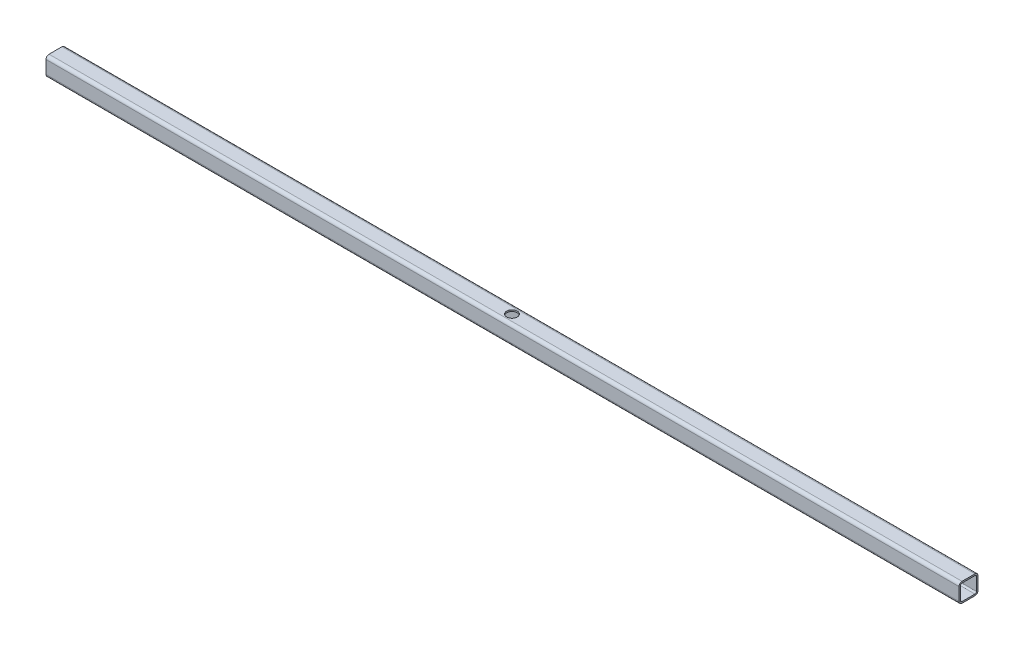
ISO-10303-21;
HEADER;
FILE_DESCRIPTION(('STEP AP214'),'2;1');
FILE_NAME('part.step','',(''),(''),'','','');
FILE_SCHEMA(('AUTOMOTIVE_DESIGN { 1 0 10303 214 1 1 1 1 }'));
ENDSEC;
DATA;
#1=APPLICATION_CONTEXT('core data for automotive mechanical design processes');
#2=APPLICATION_PROTOCOL_DEFINITION('international standard','automotive_design',2000,#1);
#3=PRODUCT_CONTEXT('',#1,'mechanical');
#4=PRODUCT('Part','Part','',(#3));
#5=PRODUCT_RELATED_PRODUCT_CATEGORY('part','',(#4));
#6=PRODUCT_DEFINITION_FORMATION('','',#4);
#7=PRODUCT_DEFINITION_CONTEXT('part definition',#1,'design');
#8=PRODUCT_DEFINITION('design','',#6,#7);
#9=PRODUCT_DEFINITION_SHAPE('','',#8);
#10=(LENGTH_UNIT() NAMED_UNIT(*) SI_UNIT(.MILLI.,.METRE.));
#11=(NAMED_UNIT(*) PLANE_ANGLE_UNIT() SI_UNIT($,.RADIAN.));
#12=(NAMED_UNIT(*) SI_UNIT($,.STERADIAN.) SOLID_ANGLE_UNIT());
#13=UNCERTAINTY_MEASURE_WITH_UNIT(LENGTH_MEASURE(1.E-05),#10,'distance_accuracy_value','');
#14=(GEOMETRIC_REPRESENTATION_CONTEXT(3) GLOBAL_UNCERTAINTY_ASSIGNED_CONTEXT((#13)) GLOBAL_UNIT_ASSIGNED_CONTEXT((#10,
#11,#12)) REPRESENTATION_CONTEXT('',''));
#15=CARTESIAN_POINT('',(0.,0.,0.));
#16=DIRECTION('',(0.,0.,1.));
#17=DIRECTION('',(1.,0.,0.));
#18=AXIS2_PLACEMENT_3D('',#15,#16,#17);
#19=CARTESIAN_POINT('',(1920.,13.6,-13.6));
#20=DIRECTION('',(-1.,0.,0.));
#21=DIRECTION('',(0.,0.,1.));
#22=AXIS2_PLACEMENT_3D('',#19,#20,#21);
#23=CYLINDRICAL_SURFACE('',#22,6.4);
#24=CARTESIAN_POINT('',(0.,13.6,-13.6));
#25=DIRECTION('',(1.,0.,0.));
#26=DIRECTION('',(0.,0.,-1.));
#27=AXIS2_PLACEMENT_3D('',#24,#25,#26);
#28=CIRCLE('',#27,6.4);
#29=CARTESIAN_POINT('',(0.,13.6,-20.));
#30=VERTEX_POINT('',#29);
#31=CARTESIAN_POINT('',(0.,20.,-13.6));
#32=VERTEX_POINT('',#31);
#33=EDGE_CURVE('E253',#30,#32,#28,.T.);
#34=ORIENTED_EDGE('',*,*,#33,.T.);
#35=DIRECTION('',(-1.,0.,0.));
#36=VECTOR('',#35,1.);
#37=CARTESIAN_POINT('',(1920.,20.,-13.6));
#38=LINE('',#37,#36);
#39=CARTESIAN_POINT('',(1920.,20.,-13.6));
#40=VERTEX_POINT('',#39);
#41=EDGE_CURVE('E12',#40,#32,#38,.T.);
#42=ORIENTED_EDGE('',*,*,#41,.F.);
#43=CARTESIAN_POINT('',(1920.,13.6,-13.6));
#44=DIRECTION('',(1.,0.,0.));
#45=DIRECTION('',(0.,0.,-1.));
#46=AXIS2_PLACEMENT_3D('',#43,#44,#45);
#47=CIRCLE('',#46,6.4);
#48=CARTESIAN_POINT('',(1920.,13.6,-20.));
#49=VERTEX_POINT('',#48);
#50=EDGE_CURVE('E362',#49,#40,#47,.T.);
#51=ORIENTED_EDGE('',*,*,#50,.F.);
#52=DIRECTION('',(-1.,0.,0.));
#53=VECTOR('',#52,1.);
#54=CARTESIAN_POINT('',(1920.,13.6,-20.));
#55=LINE('',#54,#53);
#56=EDGE_CURVE('E276',#49,#30,#55,.T.);
#57=ORIENTED_EDGE('',*,*,#56,.T.);
#58=EDGE_LOOP('',(#34,#42,#51,#57));
#59=FACE_BOUND('',#58,.T.);
#60=ADVANCED_FACE('F66',(#59),#23,.T.);
#61=CARTESIAN_POINT('',(1920.,20.,-13.6));
#62=DIRECTION('',(0.,-1.,0.));
#63=DIRECTION('',(0.,0.,-1.));
#64=AXIS2_PLACEMENT_3D('',#61,#62,#63);
#65=PLANE('',#64);
#66=CARTESIAN_POINT('',(960.,20.,0.));
#67=DIRECTION('',(0.,1.,0.));
#68=DIRECTION('',(0.,0.,1.));
#69=AXIS2_PLACEMENT_3D('',#66,#67,#68);
#70=CIRCLE('',#69,11.);
#71=CARTESIAN_POINT('',(960.,20.,11.));
#72=VERTEX_POINT('',#71);
#73=EDGE_CURVE('E445',#72,#72,#70,.T.);
#74=ORIENTED_EDGE('',*,*,#73,.F.);
#75=EDGE_LOOP('',(#74));
#76=FACE_BOUND('',#75,.T.);
#77=DIRECTION('',(0.,0.,1.));
#78=VECTOR('',#77,1.);
#79=CARTESIAN_POINT('',(0.,20.,-13.6));
#80=LINE('',#79,#78);
#81=CARTESIAN_POINT('',(0.,20.,13.6));
#82=VERTEX_POINT('',#81);
#83=EDGE_CURVE('E257',#32,#82,#80,.T.);
#84=ORIENTED_EDGE('',*,*,#83,.T.);
#85=DIRECTION('',(-1.,0.,0.));
#86=VECTOR('',#85,1.);
#87=CARTESIAN_POINT('',(1920.,20.,13.6));
#88=LINE('',#87,#86);
#89=CARTESIAN_POINT('',(1920.,20.,13.6));
#90=VERTEX_POINT('',#89);
#91=EDGE_CURVE('E77',#90,#82,#88,.T.);
#92=ORIENTED_EDGE('',*,*,#91,.F.);
#93=DIRECTION('',(0.,0.,1.));
#94=VECTOR('',#93,1.);
#95=CARTESIAN_POINT('',(1920.,20.,-13.6));
#96=LINE('',#95,#94);
#97=EDGE_CURVE('E365',#40,#90,#96,.T.);
#98=ORIENTED_EDGE('',*,*,#97,.F.);
#99=ORIENTED_EDGE('',*,*,#41,.T.);
#100=EDGE_LOOP('',(#84,#92,#98,#99));
#101=FACE_BOUND('',#100,.T.);
#102=ADVANCED_FACE('F404',(#76,#101),#65,.F.);
#103=CARTESIAN_POINT('',(1920.,13.6,13.6));
#104=DIRECTION('',(-1.,0.,0.));
#105=DIRECTION('',(0.,0.,1.));
#106=AXIS2_PLACEMENT_3D('',#103,#104,#105);
#107=CYLINDRICAL_SURFACE('',#106,6.4);
#108=CARTESIAN_POINT('',(0.,13.6,13.6));
#109=DIRECTION('',(1.,0.,0.));
#110=DIRECTION('',(0.,0.,-1.));
#111=AXIS2_PLACEMENT_3D('',#108,#109,#110);
#112=CIRCLE('',#111,6.4);
#113=CARTESIAN_POINT('',(0.,13.6,20.));
#114=VERTEX_POINT('',#113);
#115=EDGE_CURVE('E260',#82,#114,#112,.T.);
#116=ORIENTED_EDGE('',*,*,#115,.T.);
#117=DIRECTION('',(-1.,0.,0.));
#118=VECTOR('',#117,1.);
#119=CARTESIAN_POINT('',(1920.,13.6,20.));
#120=LINE('',#119,#118);
#121=CARTESIAN_POINT('',(1920.,13.6,20.));
#122=VERTEX_POINT('',#121);
#123=EDGE_CURVE('E287',#122,#114,#120,.T.);
#124=ORIENTED_EDGE('',*,*,#123,.F.);
#125=CARTESIAN_POINT('',(1920.,13.6,13.6));
#126=DIRECTION('',(1.,0.,0.));
#127=DIRECTION('',(0.,0.,-1.));
#128=AXIS2_PLACEMENT_3D('',#125,#126,#127);
#129=CIRCLE('',#128,6.4);
#130=EDGE_CURVE('E368',#90,#122,#129,.T.);
#131=ORIENTED_EDGE('',*,*,#130,.F.);
#132=ORIENTED_EDGE('',*,*,#91,.T.);
#133=EDGE_LOOP('',(#116,#124,#131,#132));
#134=FACE_BOUND('',#133,.T.);
#135=ADVANCED_FACE('F410',(#134),#107,.T.);
#136=CARTESIAN_POINT('',(1920.,-13.6,20.));
#137=DIRECTION('',(0.,0.,-1.));
#138=DIRECTION('',(0.,1.,0.));
#139=AXIS2_PLACEMENT_3D('',#136,#137,#138);
#140=PLANE('',#139);
#141=DIRECTION('',(0.,-1.,0.));
#142=VECTOR('',#141,1.);
#143=CARTESIAN_POINT('',(0.,-13.6,20.));
#144=LINE('',#143,#142);
#145=CARTESIAN_POINT('',(0.,-13.6,20.));
#146=VERTEX_POINT('',#145);
#147=EDGE_CURVE('E263',#114,#146,#144,.T.);
#148=ORIENTED_EDGE('',*,*,#147,.T.);
#149=DIRECTION('',(-1.,0.,0.));
#150=VECTOR('',#149,1.);
#151=CARTESIAN_POINT('',(1920.,-13.6,20.));
#152=LINE('',#151,#150);
#153=CARTESIAN_POINT('',(1920.,-13.6,20.));
#154=VERTEX_POINT('',#153);
#155=EDGE_CURVE('E283',#154,#146,#152,.T.);
#156=ORIENTED_EDGE('',*,*,#155,.F.);
#157=DIRECTION('',(0.,-1.,0.));
#158=VECTOR('',#157,1.);
#159=CARTESIAN_POINT('',(1920.,-13.6,20.));
#160=LINE('',#159,#158);
#161=EDGE_CURVE('E371',#122,#154,#160,.T.);
#162=ORIENTED_EDGE('',*,*,#161,.F.);
#163=ORIENTED_EDGE('',*,*,#123,.T.);
#164=EDGE_LOOP('',(#148,#156,#162,#163));
#165=FACE_BOUND('',#164,.T.);
#166=ADVANCED_FACE('F379',(#165),#140,.F.);
#167=CARTESIAN_POINT('',(1920.,-13.6,13.6));
#168=DIRECTION('',(-1.,0.,0.));
#169=DIRECTION('',(0.,0.,1.));
#170=AXIS2_PLACEMENT_3D('',#167,#168,#169);
#171=CYLINDRICAL_SURFACE('',#170,6.4);
#172=CARTESIAN_POINT('',(0.,-13.6,13.6));
#173=DIRECTION('',(1.,0.,0.));
#174=DIRECTION('',(0.,0.,-1.));
#175=AXIS2_PLACEMENT_3D('',#172,#173,#174);
#176=CIRCLE('',#175,6.4);
#177=CARTESIAN_POINT('',(0.,-20.,13.6));
#178=VERTEX_POINT('',#177);
#179=EDGE_CURVE('E266',#146,#178,#176,.T.);
#180=ORIENTED_EDGE('',*,*,#179,.T.);
#181=DIRECTION('',(-1.,0.,0.));
#182=VECTOR('',#181,1.);
#183=CARTESIAN_POINT('',(1920.,-20.,13.6));
#184=LINE('',#183,#182);
#185=CARTESIAN_POINT('',(1920.,-20.,13.6));
#186=VERTEX_POINT('',#185);
#187=EDGE_CURVE('E209',#186,#178,#184,.T.);
#188=ORIENTED_EDGE('',*,*,#187,.F.);
#189=CARTESIAN_POINT('',(1920.,-13.6,13.6));
#190=DIRECTION('',(1.,0.,0.));
#191=DIRECTION('',(0.,0.,-1.));
#192=AXIS2_PLACEMENT_3D('',#189,#190,#191);
#193=CIRCLE('',#192,6.4);
#194=EDGE_CURVE('E198',#154,#186,#193,.T.);
#195=ORIENTED_EDGE('',*,*,#194,.F.);
#196=ORIENTED_EDGE('',*,*,#155,.T.);
#197=EDGE_LOOP('',(#180,#188,#195,#196));
#198=FACE_BOUND('',#197,.T.);
#199=ADVANCED_FACE('F383',(#198),#171,.T.);
#200=CARTESIAN_POINT('',(1920.,-20.,13.6));
#201=DIRECTION('',(0.,1.,0.));
#202=DIRECTION('',(0.,0.,1.));
#203=AXIS2_PLACEMENT_3D('',#200,#201,#202);
#204=PLANE('',#203);
#205=CARTESIAN_POINT('',(960.,-20.,0.));
#206=DIRECTION('',(0.,1.,0.));
#207=DIRECTION('',(0.,0.,1.));
#208=AXIS2_PLACEMENT_3D('',#205,#206,#207);
#209=CIRCLE('',#208,11.);
#210=CARTESIAN_POINT('',(960.,-20.,11.));
#211=VERTEX_POINT('',#210);
#212=EDGE_CURVE('E443',#211,#211,#209,.T.);
#213=ORIENTED_EDGE('',*,*,#212,.T.);
#214=EDGE_LOOP('',(#213));
#215=FACE_BOUND('',#214,.T.);
#216=DIRECTION('',(0.,0.,-1.));
#217=VECTOR('',#216,1.);
#218=CARTESIAN_POINT('',(0.,-20.,13.6));
#219=LINE('',#218,#217);
#220=CARTESIAN_POINT('',(0.,-20.,-13.6));
#221=VERTEX_POINT('',#220);
#222=EDGE_CURVE('E207',#178,#221,#219,.T.);
#223=ORIENTED_EDGE('',*,*,#222,.T.);
#224=DIRECTION('',(-1.,0.,0.));
#225=VECTOR('',#224,1.);
#226=CARTESIAN_POINT('',(1920.,-20.,-13.6));
#227=LINE('',#226,#225);
#228=CARTESIAN_POINT('',(1920.,-20.,-13.6));
#229=VERTEX_POINT('',#228);
#230=EDGE_CURVE('E204',#229,#221,#227,.T.);
#231=ORIENTED_EDGE('',*,*,#230,.F.);
#232=DIRECTION('',(0.,0.,-1.));
#233=VECTOR('',#232,1.);
#234=CARTESIAN_POINT('',(1920.,-20.,13.6));
#235=LINE('',#234,#233);
#236=EDGE_CURVE('E192',#186,#229,#235,.T.);
#237=ORIENTED_EDGE('',*,*,#236,.F.);
#238=ORIENTED_EDGE('',*,*,#187,.T.);
#239=EDGE_LOOP('',(#223,#231,#237,#238));
#240=FACE_BOUND('',#239,.T.);
#241=ADVANCED_FACE('F205',(#215,#240),#204,.F.);
#242=CARTESIAN_POINT('',(1920.,-13.6,-13.6));
#243=DIRECTION('',(-1.,0.,0.));
#244=DIRECTION('',(0.,0.,1.));
#245=AXIS2_PLACEMENT_3D('',#242,#243,#244);
#246=CYLINDRICAL_SURFACE('',#245,6.4);
#247=CARTESIAN_POINT('',(0.,-13.6,-13.6));
#248=DIRECTION('',(1.,0.,0.));
#249=DIRECTION('',(0.,0.,-1.));
#250=AXIS2_PLACEMENT_3D('',#247,#248,#249);
#251=CIRCLE('',#250,6.4);
#252=CARTESIAN_POINT('',(0.,-13.6,-20.));
#253=VERTEX_POINT('',#252);
#254=EDGE_CURVE('E139',#221,#253,#251,.T.);
#255=ORIENTED_EDGE('',*,*,#254,.T.);
#256=DIRECTION('',(-1.,0.,0.));
#257=VECTOR('',#256,1.);
#258=CARTESIAN_POINT('',(1920.,-13.6,-20.));
#259=LINE('',#258,#257);
#260=CARTESIAN_POINT('',(1920.,-13.6,-20.));
#261=VERTEX_POINT('',#260);
#262=EDGE_CURVE('E210',#261,#253,#259,.T.);
#263=ORIENTED_EDGE('',*,*,#262,.F.);
#264=CARTESIAN_POINT('',(1920.,-13.6,-13.6));
#265=DIRECTION('',(1.,0.,0.));
#266=DIRECTION('',(0.,0.,-1.));
#267=AXIS2_PLACEMENT_3D('',#264,#265,#266);
#268=CIRCLE('',#267,6.4);
#269=EDGE_CURVE('E196',#229,#261,#268,.T.);
#270=ORIENTED_EDGE('',*,*,#269,.F.);
#271=ORIENTED_EDGE('',*,*,#230,.T.);
#272=EDGE_LOOP('',(#255,#263,#270,#271));
#273=FACE_BOUND('',#272,.T.);
#274=ADVANCED_FACE('F212',(#273),#246,.T.);
#275=CARTESIAN_POINT('',(1920.,13.6,13.6));
#276=DIRECTION('',(-1.,0.,0.));
#277=DIRECTION('',(0.,0.,1.));
#278=AXIS2_PLACEMENT_3D('',#275,#276,#277);
#279=CYLINDRICAL_SURFACE('',#278,3.2);
#280=CARTESIAN_POINT('',(0.,13.6,13.6));
#281=DIRECTION('',(1.,0.,0.));
#282=DIRECTION('',(0.,0.,-1.));
#283=AXIS2_PLACEMENT_3D('',#280,#281,#282);
#284=CIRCLE('',#283,3.2);
#285=CARTESIAN_POINT('',(0.,16.8,13.6));
#286=VERTEX_POINT('',#285);
#287=CARTESIAN_POINT('',(0.,13.6,16.8));
#288=VERTEX_POINT('',#287);
#289=EDGE_CURVE('E220',#286,#288,#284,.T.);
#290=ORIENTED_EDGE('',*,*,#289,.F.);
#291=DIRECTION('',(-1.,0.,0.));
#292=VECTOR('',#291,1.);
#293=CARTESIAN_POINT('',(1920.,16.8,13.6));
#294=LINE('',#293,#292);
#295=CARTESIAN_POINT('',(1920.,16.8,13.6));
#296=VERTEX_POINT('',#295);
#297=EDGE_CURVE('E153',#296,#286,#294,.T.);
#298=ORIENTED_EDGE('',*,*,#297,.F.);
#299=CARTESIAN_POINT('',(1920.,13.6,13.6));
#300=DIRECTION('',(1.,0.,0.));
#301=DIRECTION('',(0.,0.,-1.));
#302=AXIS2_PLACEMENT_3D('',#299,#300,#301);
#303=CIRCLE('',#302,3.2);
#304=CARTESIAN_POINT('',(1920.,13.6,16.8));
#305=VERTEX_POINT('',#304);
#306=EDGE_CURVE('E275',#296,#305,#303,.T.);
#307=ORIENTED_EDGE('',*,*,#306,.T.);
#308=DIRECTION('',(-1.,0.,0.));
#309=VECTOR('',#308,1.);
#310=CARTESIAN_POINT('',(1920.,13.6,16.8));
#311=LINE('',#310,#309);
#312=EDGE_CURVE('E216',#305,#288,#311,.T.);
#313=ORIENTED_EDGE('',*,*,#312,.T.);
#314=EDGE_LOOP('',(#290,#298,#307,#313));
#315=FACE_BOUND('',#314,.T.);
#316=ADVANCED_FACE('F68',(#315),#279,.F.);
#317=CARTESIAN_POINT('',(1920.,16.8,-13.6));
#318=DIRECTION('',(0.,-1.,0.));
#319=DIRECTION('',(0.,0.,-1.));
#320=AXIS2_PLACEMENT_3D('',#317,#318,#319);
#321=PLANE('',#320);
#322=CARTESIAN_POINT('',(960.,16.8,0.));
#323=DIRECTION('',(0.,-1.,0.));
#324=DIRECTION('',(0.,0.,-1.));
#325=AXIS2_PLACEMENT_3D('',#322,#323,#324);
#326=CIRCLE('',#325,11.);
#327=CARTESIAN_POINT('',(960.,16.8,-11.));
#328=VERTEX_POINT('',#327);
#329=EDGE_CURVE('E225',#328,#328,#326,.T.);
#330=ORIENTED_EDGE('',*,*,#329,.F.);
#331=EDGE_LOOP('',(#330));
#332=FACE_BOUND('',#331,.T.);
#333=DIRECTION('',(0.,0.,1.));
#334=VECTOR('',#333,1.);
#335=CARTESIAN_POINT('',(0.,16.8,-13.6));
#336=LINE('',#335,#334);
#337=CARTESIAN_POINT('',(0.,16.8,-13.6));
#338=VERTEX_POINT('',#337);
#339=EDGE_CURVE('E224',#338,#286,#336,.T.);
#340=ORIENTED_EDGE('',*,*,#339,.F.);
#341=DIRECTION('',(-1.,0.,0.));
#342=VECTOR('',#341,1.);
#343=CARTESIAN_POINT('',(1920.,16.8,-13.6));
#344=LINE('',#343,#342);
#345=CARTESIAN_POINT('',(1920.,16.8,-13.6));
#346=VERTEX_POINT('',#345);
#347=EDGE_CURVE('E311',#346,#338,#344,.T.);
#348=ORIENTED_EDGE('',*,*,#347,.F.);
#349=DIRECTION('',(0.,0.,1.));
#350=VECTOR('',#349,1.);
#351=CARTESIAN_POINT('',(1920.,16.8,-13.6));
#352=LINE('',#351,#350);
#353=EDGE_CURVE('E319',#346,#296,#352,.T.);
#354=ORIENTED_EDGE('',*,*,#353,.T.);
#355=ORIENTED_EDGE('',*,*,#297,.T.);
#356=EDGE_LOOP('',(#340,#348,#354,#355));
#357=FACE_BOUND('',#356,.T.);
#358=ADVANCED_FACE('F317',(#332,#357),#321,.T.);
#359=CARTESIAN_POINT('',(1920.,13.6,-13.6));
#360=DIRECTION('',(-1.,0.,0.));
#361=DIRECTION('',(0.,0.,1.));
#362=AXIS2_PLACEMENT_3D('',#359,#360,#361);
#363=CYLINDRICAL_SURFACE('',#362,3.2);
#364=CARTESIAN_POINT('',(0.,13.6,-13.6));
#365=DIRECTION('',(1.,0.,0.));
#366=DIRECTION('',(0.,0.,-1.));
#367=AXIS2_PLACEMENT_3D('',#364,#365,#366);
#368=CIRCLE('',#367,3.2);
#369=CARTESIAN_POINT('',(0.,13.6,-16.8));
#370=VERTEX_POINT('',#369);
#371=EDGE_CURVE('E229',#370,#338,#368,.T.);
#372=ORIENTED_EDGE('',*,*,#371,.F.);
#373=DIRECTION('',(-1.,0.,0.));
#374=VECTOR('',#373,1.);
#375=CARTESIAN_POINT('',(1920.,13.6,-16.8));
#376=LINE('',#375,#374);
#377=CARTESIAN_POINT('',(1920.,13.6,-16.8));
#378=VERTEX_POINT('',#377);
#379=EDGE_CURVE('E308',#378,#370,#376,.T.);
#380=ORIENTED_EDGE('',*,*,#379,.F.);
#381=CARTESIAN_POINT('',(1920.,13.6,-13.6));
#382=DIRECTION('',(1.,0.,0.));
#383=DIRECTION('',(0.,0.,-1.));
#384=AXIS2_PLACEMENT_3D('',#381,#382,#383);
#385=CIRCLE('',#384,3.2);
#386=EDGE_CURVE('E330',#378,#346,#385,.T.);
#387=ORIENTED_EDGE('',*,*,#386,.T.);
#388=ORIENTED_EDGE('',*,*,#347,.T.);
#389=EDGE_LOOP('',(#372,#380,#387,#388));
#390=FACE_BOUND('',#389,.T.);
#391=ADVANCED_FACE('F327',(#390),#363,.F.);
#392=CARTESIAN_POINT('',(1920.,13.6,-16.8));
#393=DIRECTION('',(0.,0.,1.));
#394=DIRECTION('',(1.,0.,0.));
#395=AXIS2_PLACEMENT_3D('',#392,#393,#394);
#396=PLANE('',#395);
#397=DIRECTION('',(0.,1.,0.));
#398=VECTOR('',#397,1.);
#399=CARTESIAN_POINT('',(0.,13.6,-16.8));
#400=LINE('',#399,#398);
#401=CARTESIAN_POINT('',(0.,-13.6,-16.8));
#402=VERTEX_POINT('',#401);
#403=EDGE_CURVE('E233',#402,#370,#400,.T.);
#404=ORIENTED_EDGE('',*,*,#403,.F.);
#405=DIRECTION('',(-1.,0.,0.));
#406=VECTOR('',#405,1.);
#407=CARTESIAN_POINT('',(1920.,-13.6,-16.8));
#408=LINE('',#407,#406);
#409=CARTESIAN_POINT('',(1920.,-13.6,-16.8));
#410=VERTEX_POINT('',#409);
#411=EDGE_CURVE('E305',#410,#402,#408,.T.);
#412=ORIENTED_EDGE('',*,*,#411,.F.);
#413=DIRECTION('',(0.,1.,0.));
#414=VECTOR('',#413,1.);
#415=CARTESIAN_POINT('',(1920.,13.6,-16.8));
#416=LINE('',#415,#414);
#417=EDGE_CURVE('E339',#410,#378,#416,.T.);
#418=ORIENTED_EDGE('',*,*,#417,.T.);
#419=ORIENTED_EDGE('',*,*,#379,.T.);
#420=EDGE_LOOP('',(#404,#412,#418,#419));
#421=FACE_BOUND('',#420,.T.);
#422=ADVANCED_FACE('F425',(#421),#396,.T.);
#423=CARTESIAN_POINT('',(1920.,-13.6,-13.6));
#424=DIRECTION('',(-1.,0.,0.));
#425=DIRECTION('',(0.,0.,1.));
#426=AXIS2_PLACEMENT_3D('',#423,#424,#425);
#427=CYLINDRICAL_SURFACE('',#426,3.2);
#428=CARTESIAN_POINT('',(0.,-13.6,-13.6));
#429=DIRECTION('',(1.,0.,0.));
#430=DIRECTION('',(0.,0.,-1.));
#431=AXIS2_PLACEMENT_3D('',#428,#429,#430);
#432=CIRCLE('',#431,3.2);
#433=CARTESIAN_POINT('',(0.,-16.8,-13.6));
#434=VERTEX_POINT('',#433);
#435=EDGE_CURVE('E237',#434,#402,#432,.T.);
#436=ORIENTED_EDGE('',*,*,#435,.F.);
#437=DIRECTION('',(-1.,0.,0.));
#438=VECTOR('',#437,1.);
#439=CARTESIAN_POINT('',(1920.,-16.8,-13.6));
#440=LINE('',#439,#438);
#441=CARTESIAN_POINT('',(1920.,-16.8,-13.6));
#442=VERTEX_POINT('',#441);
#443=EDGE_CURVE('E302',#442,#434,#440,.T.);
#444=ORIENTED_EDGE('',*,*,#443,.F.);
#445=CARTESIAN_POINT('',(1920.,-13.6,-13.6));
#446=DIRECTION('',(1.,0.,0.));
#447=DIRECTION('',(0.,0.,-1.));
#448=AXIS2_PLACEMENT_3D('',#445,#446,#447);
#449=CIRCLE('',#448,3.2);
#450=EDGE_CURVE('E346',#442,#410,#449,.T.);
#451=ORIENTED_EDGE('',*,*,#450,.T.);
#452=ORIENTED_EDGE('',*,*,#411,.T.);
#453=EDGE_LOOP('',(#436,#444,#451,#452));
#454=FACE_BOUND('',#453,.T.);
#455=ADVANCED_FACE('F421',(#454),#427,.F.);
#456=CARTESIAN_POINT('',(1920.,-16.8,13.6));
#457=DIRECTION('',(0.,1.,0.));
#458=DIRECTION('',(0.,0.,1.));
#459=AXIS2_PLACEMENT_3D('',#456,#457,#458);
#460=PLANE('',#459);
#461=CARTESIAN_POINT('',(960.,-16.8,0.));
#462=DIRECTION('',(0.,1.,0.));
#463=DIRECTION('',(0.,0.,1.));
#464=AXIS2_PLACEMENT_3D('',#461,#462,#463);
#465=CIRCLE('',#464,11.);
#466=CARTESIAN_POINT('',(960.,-16.8,11.));
#467=VERTEX_POINT('',#466);
#468=EDGE_CURVE('E70',#467,#467,#465,.T.);
#469=ORIENTED_EDGE('',*,*,#468,.F.);
#470=EDGE_LOOP('',(#469));
#471=FACE_BOUND('',#470,.T.);
#472=DIRECTION('',(0.,0.,-1.));
#473=VECTOR('',#472,1.);
#474=CARTESIAN_POINT('',(0.,-16.8,13.6));
#475=LINE('',#474,#473);
#476=CARTESIAN_POINT('',(0.,-16.8,13.6));
#477=VERTEX_POINT('',#476);
#478=EDGE_CURVE('E241',#477,#434,#475,.T.);
#479=ORIENTED_EDGE('',*,*,#478,.F.);
#480=DIRECTION('',(-1.,0.,0.));
#481=VECTOR('',#480,1.);
#482=CARTESIAN_POINT('',(1920.,-16.8,13.6));
#483=LINE('',#482,#481);
#484=CARTESIAN_POINT('',(1920.,-16.8,13.6));
#485=VERTEX_POINT('',#484);
#486=EDGE_CURVE('E299',#485,#477,#483,.T.);
#487=ORIENTED_EDGE('',*,*,#486,.F.);
#488=DIRECTION('',(0.,0.,-1.));
#489=VECTOR('',#488,1.);
#490=CARTESIAN_POINT('',(1920.,-16.8,13.6));
#491=LINE('',#490,#489);
#492=EDGE_CURVE('E350',#485,#442,#491,.T.);
#493=ORIENTED_EDGE('',*,*,#492,.T.);
#494=ORIENTED_EDGE('',*,*,#443,.T.);
#495=EDGE_LOOP('',(#479,#487,#493,#494));
#496=FACE_BOUND('',#495,.T.);
#497=ADVANCED_FACE('F417',(#471,#496),#460,.T.);
#498=CARTESIAN_POINT('',(1920.,-13.6,13.6));
#499=DIRECTION('',(-1.,0.,0.));
#500=DIRECTION('',(0.,0.,1.));
#501=AXIS2_PLACEMENT_3D('',#498,#499,#500);
#502=CYLINDRICAL_SURFACE('',#501,3.2);
#503=CARTESIAN_POINT('',(0.,-13.6,13.6));
#504=DIRECTION('',(1.,0.,0.));
#505=DIRECTION('',(0.,0.,-1.));
#506=AXIS2_PLACEMENT_3D('',#503,#504,#505);
#507=CIRCLE('',#506,3.2);
#508=CARTESIAN_POINT('',(0.,-13.6,16.8));
#509=VERTEX_POINT('',#508);
#510=EDGE_CURVE('E245',#509,#477,#507,.T.);
#511=ORIENTED_EDGE('',*,*,#510,.F.);
#512=DIRECTION('',(-1.,0.,0.));
#513=VECTOR('',#512,1.);
#514=CARTESIAN_POINT('',(1920.,-13.6,16.8));
#515=LINE('',#514,#513);
#516=CARTESIAN_POINT('',(1920.,-13.6,16.8));
#517=VERTEX_POINT('',#516);
#518=EDGE_CURVE('E296',#517,#509,#515,.T.);
#519=ORIENTED_EDGE('',*,*,#518,.F.);
#520=CARTESIAN_POINT('',(1920.,-13.6,13.6));
#521=DIRECTION('',(1.,0.,0.));
#522=DIRECTION('',(0.,0.,-1.));
#523=AXIS2_PLACEMENT_3D('',#520,#521,#522);
#524=CIRCLE('',#523,3.2);
#525=EDGE_CURVE('E354',#517,#485,#524,.T.);
#526=ORIENTED_EDGE('',*,*,#525,.T.);
#527=ORIENTED_EDGE('',*,*,#486,.T.);
#528=EDGE_LOOP('',(#511,#519,#526,#527));
#529=FACE_BOUND('',#528,.T.);
#530=ADVANCED_FACE('F398',(#529),#502,.F.);
#531=CARTESIAN_POINT('',(1920.,-13.6,16.8));
#532=DIRECTION('',(0.,0.,-1.));
#533=DIRECTION('',(0.,1.,0.));
#534=AXIS2_PLACEMENT_3D('',#531,#532,#533);
#535=PLANE('',#534);
#536=DIRECTION('',(0.,-1.,0.));
#537=VECTOR('',#536,1.);
#538=CARTESIAN_POINT('',(0.,-13.6,16.8));
#539=LINE('',#538,#537);
#540=EDGE_CURVE('E249',#288,#509,#539,.T.);
#541=ORIENTED_EDGE('',*,*,#540,.F.);
#542=ORIENTED_EDGE('',*,*,#312,.F.);
#543=DIRECTION('',(0.,-1.,0.));
#544=VECTOR('',#543,1.);
#545=CARTESIAN_POINT('',(1920.,-13.6,16.8));
#546=LINE('',#545,#544);
#547=EDGE_CURVE('E358',#305,#517,#546,.T.);
#548=ORIENTED_EDGE('',*,*,#547,.T.);
#549=ORIENTED_EDGE('',*,*,#518,.T.);
#550=EDGE_LOOP('',(#541,#542,#548,#549));
#551=FACE_BOUND('',#550,.T.);
#552=ADVANCED_FACE('F391',(#551),#535,.T.);
#553=CARTESIAN_POINT('',(1920.,13.6,-20.));
#554=DIRECTION('',(0.,0.,1.));
#555=DIRECTION('',(1.,0.,0.));
#556=AXIS2_PLACEMENT_3D('',#553,#554,#555);
#557=PLANE('',#556);
#558=DIRECTION('',(0.,1.,0.));
#559=VECTOR('',#558,1.);
#560=CARTESIAN_POINT('',(0.,13.6,-20.));
#561=LINE('',#560,#559);
#562=EDGE_CURVE('E145',#253,#30,#561,.T.);
#563=ORIENTED_EDGE('',*,*,#562,.T.);
#564=ORIENTED_EDGE('',*,*,#56,.F.);
#565=DIRECTION('',(0.,1.,0.));
#566=VECTOR('',#565,1.);
#567=CARTESIAN_POINT('',(1920.,13.6,-20.));
#568=LINE('',#567,#566);
#569=EDGE_CURVE('E86',#261,#49,#568,.T.);
#570=ORIENTED_EDGE('',*,*,#569,.F.);
#571=ORIENTED_EDGE('',*,*,#262,.T.);
#572=EDGE_LOOP('',(#563,#564,#570,#571));
#573=FACE_BOUND('',#572,.T.);
#574=ADVANCED_FACE('F389',(#573),#557,.F.);
#575=CARTESIAN_POINT('',(1920.,13.6,-13.6));
#576=DIRECTION('',(1.,0.,0.));
#577=DIRECTION('',(0.,0.,-1.));
#578=AXIS2_PLACEMENT_3D('',#575,#576,#577);
#579=PLANE('',#578);
#580=ORIENTED_EDGE('',*,*,#306,.F.);
#581=ORIENTED_EDGE('',*,*,#353,.F.);
#582=ORIENTED_EDGE('',*,*,#386,.F.);
#583=ORIENTED_EDGE('',*,*,#417,.F.);
#584=ORIENTED_EDGE('',*,*,#450,.F.);
#585=ORIENTED_EDGE('',*,*,#492,.F.);
#586=ORIENTED_EDGE('',*,*,#525,.F.);
#587=ORIENTED_EDGE('',*,*,#547,.F.);
#588=EDGE_LOOP('',(#580,#581,#582,#583,#584,#585,#586,#587));
#589=FACE_BOUND('',#588,.T.);
#590=ORIENTED_EDGE('',*,*,#50,.T.);
#591=ORIENTED_EDGE('',*,*,#97,.T.);
#592=ORIENTED_EDGE('',*,*,#130,.T.);
#593=ORIENTED_EDGE('',*,*,#161,.T.);
#594=ORIENTED_EDGE('',*,*,#194,.T.);
#595=ORIENTED_EDGE('',*,*,#236,.T.);
#596=ORIENTED_EDGE('',*,*,#269,.T.);
#597=ORIENTED_EDGE('',*,*,#569,.T.);
#598=EDGE_LOOP('',(#590,#591,#592,#593,#594,#595,#596,#597));
#599=FACE_BOUND('',#598,.T.);
#600=ADVANCED_FACE('F194',(#589,#599),#579,.T.);
#601=CARTESIAN_POINT('',(0.,13.6,-13.6));
#602=DIRECTION('',(1.,0.,0.));
#603=DIRECTION('',(0.,0.,-1.));
#604=AXIS2_PLACEMENT_3D('',#601,#602,#603);
#605=PLANE('',#604);
#606=ORIENTED_EDGE('',*,*,#289,.T.);
#607=ORIENTED_EDGE('',*,*,#540,.T.);
#608=ORIENTED_EDGE('',*,*,#510,.T.);
#609=ORIENTED_EDGE('',*,*,#478,.T.);
#610=ORIENTED_EDGE('',*,*,#435,.T.);
#611=ORIENTED_EDGE('',*,*,#403,.T.);
#612=ORIENTED_EDGE('',*,*,#371,.T.);
#613=ORIENTED_EDGE('',*,*,#339,.T.);
#614=EDGE_LOOP('',(#606,#607,#608,#609,#610,#611,#612,#613));
#615=FACE_BOUND('',#614,.T.);
#616=ORIENTED_EDGE('',*,*,#33,.F.);
#617=ORIENTED_EDGE('',*,*,#562,.F.);
#618=ORIENTED_EDGE('',*,*,#254,.F.);
#619=ORIENTED_EDGE('',*,*,#222,.F.);
#620=ORIENTED_EDGE('',*,*,#179,.F.);
#621=ORIENTED_EDGE('',*,*,#147,.F.);
#622=ORIENTED_EDGE('',*,*,#115,.F.);
#623=ORIENTED_EDGE('',*,*,#83,.F.);
#624=EDGE_LOOP('',(#616,#617,#618,#619,#620,#621,#622,#623));
#625=FACE_BOUND('',#624,.T.);
#626=ADVANCED_FACE('F322',(#615,#625),#605,.F.);
#627=CARTESIAN_POINT('',(960.,-20.,0.));
#628=DIRECTION('',(0.,1.,0.));
#629=DIRECTION('',(0.,0.,1.));
#630=AXIS2_PLACEMENT_3D('',#627,#628,#629);
#631=CYLINDRICAL_SURFACE('',#630,11.);
#632=ORIENTED_EDGE('',*,*,#468,.T.);
#633=EDGE_LOOP('',(#632));
#634=FACE_BOUND('',#633,.T.);
#635=ORIENTED_EDGE('',*,*,#212,.F.);
#636=EDGE_LOOP('',(#635));
#637=FACE_BOUND('',#636,.T.);
#638=ADVANCED_FACE('F454',(#634,#637),#631,.F.);
#639=ORIENTED_EDGE('',*,*,#329,.T.);
#640=EDGE_LOOP('',(#639));
#641=FACE_BOUND('',#640,.T.);
#642=ORIENTED_EDGE('',*,*,#73,.T.);
#643=EDGE_LOOP('',(#642));
#644=FACE_BOUND('',#643,.T.);
#645=ADVANCED_FACE('F456',(#641,#644),#631,.F.);
#646=CLOSED_SHELL('',(#60,#102,#135,#166,#199,#241,#274,#316,#358,#391,#422,#455,#497,#530,#552,
#574,#600,#626,#638,#645));
#647=MANIFOLD_SOLID_BREP('B2',#646);
#648=ADVANCED_BREP_SHAPE_REPRESENTATION('',(#18,#647),#14);
#649=SHAPE_DEFINITION_REPRESENTATION(#9,#648);
ENDSEC;
END-ISO-10303-21;
